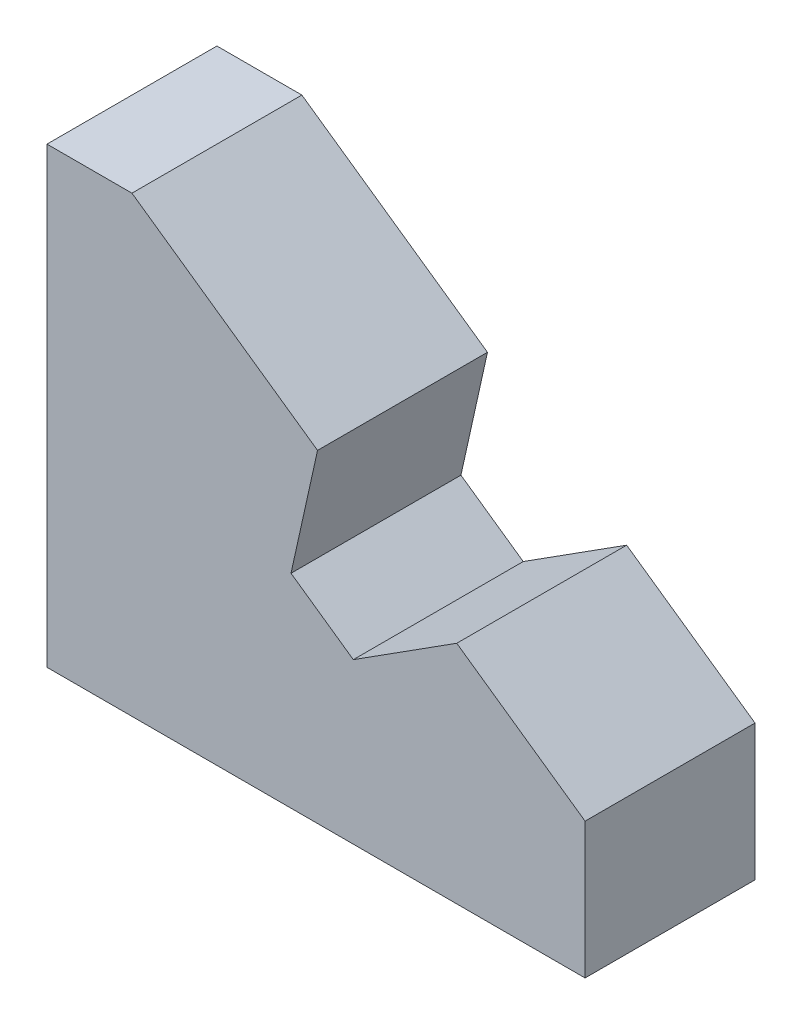
ISO-10303-21;
HEADER;
FILE_DESCRIPTION(('STEP AP214'),'2;1');
FILE_NAME('part.step','',(''),(''),'','','');
FILE_SCHEMA(('AUTOMOTIVE_DESIGN { 1 0 10303 214 1 1 1 1 }'));
ENDSEC;
DATA;
#1=APPLICATION_CONTEXT('core data for automotive mechanical design processes');
#2=APPLICATION_PROTOCOL_DEFINITION('international standard','automotive_design',2000,#1);
#3=PRODUCT_CONTEXT('',#1,'mechanical');
#4=PRODUCT('Part','Part','',(#3));
#5=PRODUCT_RELATED_PRODUCT_CATEGORY('part','',(#4));
#6=PRODUCT_DEFINITION_FORMATION('','',#4);
#7=PRODUCT_DEFINITION_CONTEXT('part definition',#1,'design');
#8=PRODUCT_DEFINITION('design','',#6,#7);
#9=PRODUCT_DEFINITION_SHAPE('','',#8);
#10=(LENGTH_UNIT() NAMED_UNIT(*) SI_UNIT(.MILLI.,.METRE.));
#11=(NAMED_UNIT(*) PLANE_ANGLE_UNIT() SI_UNIT($,.RADIAN.));
#12=(NAMED_UNIT(*) SI_UNIT($,.STERADIAN.) SOLID_ANGLE_UNIT());
#13=UNCERTAINTY_MEASURE_WITH_UNIT(LENGTH_MEASURE(1.E-05),#10,'distance_accuracy_value','');
#14=(GEOMETRIC_REPRESENTATION_CONTEXT(3) GLOBAL_UNCERTAINTY_ASSIGNED_CONTEXT((#13)) GLOBAL_UNIT_ASSIGNED_CONTEXT((#10,
#11,#12)) REPRESENTATION_CONTEXT('',''));
#15=CARTESIAN_POINT('',(0.,0.,0.));
#16=DIRECTION('',(0.,0.,1.));
#17=DIRECTION('',(1.,0.,0.));
#18=AXIS2_PLACEMENT_3D('',#15,#16,#17);
#19=CARTESIAN_POINT('',(54.0830366454055,28.2182713495315,30.));
#20=DIRECTION('',(-0.537299608346825,0.843391445812885,0.));
#21=DIRECTION('',(-0.843391445812885,-0.537299608346825,0.));
#22=AXIS2_PLACEMENT_3D('',#19,#20,#21);
#23=PLANE('',#22);
#24=DIRECTION('',(0.843391445812885,0.537299608346825,0.));
#25=VECTOR('',#24,1.);
#26=CARTESIAN_POINT('',(54.0830366454055,28.2182713495315,0.));
#27=LINE('',#26,#25);
#28=CARTESIAN_POINT('',(54.0830366454055,28.2182713495315,0.));
#29=VERTEX_POINT('',#28);
#30=CARTESIAN_POINT('',(72.3406431002294,39.8496494554267,0.));
#31=VERTEX_POINT('',#30);
#32=EDGE_CURVE('E144',#29,#31,#27,.T.);
#33=ORIENTED_EDGE('',*,*,#32,.F.);
#34=DIRECTION('',(0.,0.,-1.));
#35=VECTOR('',#34,1.);
#36=CARTESIAN_POINT('',(54.0830366454055,28.2182713495315,30.));
#37=LINE('',#36,#35);
#38=CARTESIAN_POINT('',(54.0830366454055,28.2182713495315,30.));
#39=VERTEX_POINT('',#38);
#40=EDGE_CURVE('E11',#39,#29,#37,.T.);
#41=ORIENTED_EDGE('',*,*,#40,.F.);
#42=DIRECTION('',(0.843391445812885,0.537299608346825,0.));
#43=VECTOR('',#42,1.);
#44=CARTESIAN_POINT('',(54.0830366454055,28.2182713495315,30.));
#45=LINE('',#44,#43);
#46=CARTESIAN_POINT('',(72.3406431002294,39.8496494554267,30.));
#47=VERTEX_POINT('',#46);
#48=EDGE_CURVE('E167',#39,#47,#45,.T.);
#49=ORIENTED_EDGE('',*,*,#48,.T.);
#50=DIRECTION('',(0.,0.,-1.));
#51=VECTOR('',#50,1.);
#52=CARTESIAN_POINT('',(72.3406431002294,39.8496494554267,30.));
#53=LINE('',#52,#51);
#54=EDGE_CURVE('E44',#47,#31,#53,.T.);
#55=ORIENTED_EDGE('',*,*,#54,.T.);
#56=EDGE_LOOP('',(#33,#41,#49,#55));
#57=FACE_BOUND('',#56,.T.);
#58=ADVANCED_FACE('F41',(#57),#23,.T.);
#59=CARTESIAN_POINT('',(43.0806307723416,35.9222388802937,30.));
#60=DIRECTION('',(0.573576436351047,0.819152044288991,0.));
#61=DIRECTION('',(-0.819152044288991,0.573576436351047,0.));
#62=AXIS2_PLACEMENT_3D('',#59,#60,#61);
#63=PLANE('',#62);
#64=DIRECTION('',(0.819152044288991,-0.573576436351047,0.));
#65=VECTOR('',#64,1.);
#66=CARTESIAN_POINT('',(43.0806307723416,35.9222388802937,0.));
#67=LINE('',#66,#65);
#68=CARTESIAN_POINT('',(43.0806307723416,35.9222388802937,0.));
#69=VERTEX_POINT('',#68);
#70=EDGE_CURVE('E165',#69,#29,#67,.T.);
#71=ORIENTED_EDGE('',*,*,#70,.F.);
#72=DIRECTION('',(0.,0.,-1.));
#73=VECTOR('',#72,1.);
#74=CARTESIAN_POINT('',(43.0806307723416,35.9222388802937,30.));
#75=LINE('',#74,#73);
#76=CARTESIAN_POINT('',(43.0806307723416,35.9222388802937,30.));
#77=VERTEX_POINT('',#76);
#78=EDGE_CURVE('E50',#77,#69,#75,.T.);
#79=ORIENTED_EDGE('',*,*,#78,.F.);
#80=DIRECTION('',(0.819152044288991,-0.573576436351047,0.));
#81=VECTOR('',#80,1.);
#82=CARTESIAN_POINT('',(43.0806307723416,35.9222388802937,30.));
#83=LINE('',#82,#81);
#84=EDGE_CURVE('E134',#77,#39,#83,.T.);
#85=ORIENTED_EDGE('',*,*,#84,.T.);
#86=ORIENTED_EDGE('',*,*,#40,.T.);
#87=EDGE_LOOP('',(#71,#79,#85,#86));
#88=FACE_BOUND('',#87,.T.);
#89=ADVANCED_FACE('F181',(#88),#63,.T.);
#90=CARTESIAN_POINT('',(47.7660817715596,57.0569425459581,30.));
#91=DIRECTION('',(0.976296007119932,-0.216439613938107,0.));
#92=DIRECTION('',(0.216439613938107,0.976296007119932,0.));
#93=AXIS2_PLACEMENT_3D('',#90,#91,#92);
#94=PLANE('',#93);
#95=DIRECTION('',(-0.216439613938107,-0.976296007119932,0.));
#96=VECTOR('',#95,1.);
#97=CARTESIAN_POINT('',(47.7660817715596,57.0569425459581,0.));
#98=LINE('',#97,#96);
#99=CARTESIAN_POINT('',(47.7660817715596,57.0569425459581,0.));
#100=VERTEX_POINT('',#99);
#101=EDGE_CURVE('E121',#100,#69,#98,.T.);
#102=ORIENTED_EDGE('',*,*,#101,.F.);
#103=DIRECTION('',(0.,0.,-1.));
#104=VECTOR('',#103,1.);
#105=CARTESIAN_POINT('',(47.7660817715596,57.0569425459581,30.));
#106=LINE('',#105,#104);
#107=CARTESIAN_POINT('',(47.7660817715596,57.0569425459581,30.));
#108=VERTEX_POINT('',#107);
#109=EDGE_CURVE('E116',#108,#100,#106,.T.);
#110=ORIENTED_EDGE('',*,*,#109,.F.);
#111=DIRECTION('',(-0.216439613938107,-0.976296007119932,0.));
#112=VECTOR('',#111,1.);
#113=CARTESIAN_POINT('',(47.7660817715596,57.0569425459581,30.));
#114=LINE('',#113,#112);
#115=EDGE_CURVE('E119',#108,#77,#114,.T.);
#116=ORIENTED_EDGE('',*,*,#115,.T.);
#117=ORIENTED_EDGE('',*,*,#78,.T.);
#118=EDGE_LOOP('',(#102,#110,#116,#117));
#119=FACE_BOUND('',#118,.T.);
#120=ADVANCED_FACE('F118',(#119),#94,.T.);
#121=CARTESIAN_POINT('',(15.,80.,30.));
#122=DIRECTION('',(0.573576436351047,0.819152044288991,0.));
#123=DIRECTION('',(-0.819152044288991,0.573576436351047,0.));
#124=AXIS2_PLACEMENT_3D('',#121,#122,#123);
#125=PLANE('',#124);
#126=DIRECTION('',(0.819152044288991,-0.573576436351047,0.));
#127=VECTOR('',#126,1.);
#128=CARTESIAN_POINT('',(15.,80.,0.));
#129=LINE('',#128,#127);
#130=CARTESIAN_POINT('',(15.,80.,0.));
#131=VERTEX_POINT('',#130);
#132=EDGE_CURVE('E162',#131,#100,#129,.T.);
#133=ORIENTED_EDGE('',*,*,#132,.F.);
#134=DIRECTION('',(0.,0.,-1.));
#135=VECTOR('',#134,1.);
#136=CARTESIAN_POINT('',(15.,80.,30.));
#137=LINE('',#136,#135);
#138=CARTESIAN_POINT('',(15.,80.,30.));
#139=VERTEX_POINT('',#138);
#140=EDGE_CURVE('E126',#139,#131,#137,.T.);
#141=ORIENTED_EDGE('',*,*,#140,.F.);
#142=DIRECTION('',(0.819152044288991,-0.573576436351047,0.));
#143=VECTOR('',#142,1.);
#144=CARTESIAN_POINT('',(15.,80.,30.));
#145=LINE('',#144,#143);
#146=EDGE_CURVE('E132',#139,#108,#145,.T.);
#147=ORIENTED_EDGE('',*,*,#146,.T.);
#148=ORIENTED_EDGE('',*,*,#109,.T.);
#149=EDGE_LOOP('',(#133,#141,#147,#148));
#150=FACE_BOUND('',#149,.T.);
#151=ADVANCED_FACE('F136',(#150),#125,.T.);
#152=CARTESIAN_POINT('',(0.,80.,30.));
#153=DIRECTION('',(0.,1.,0.));
#154=DIRECTION('',(0.,0.,1.));
#155=AXIS2_PLACEMENT_3D('',#152,#153,#154);
#156=PLANE('',#155);
#157=DIRECTION('',(1.,0.,0.));
#158=VECTOR('',#157,1.);
#159=CARTESIAN_POINT('',(0.,80.,0.));
#160=LINE('',#159,#158);
#161=CARTESIAN_POINT('',(0.,80.,0.));
#162=VERTEX_POINT('',#161);
#163=EDGE_CURVE('E159',#162,#131,#160,.T.);
#164=ORIENTED_EDGE('',*,*,#163,.F.);
#165=DIRECTION('',(0.,0.,-1.));
#166=VECTOR('',#165,1.);
#167=CARTESIAN_POINT('',(0.,80.,30.));
#168=LINE('',#167,#166);
#169=CARTESIAN_POINT('',(0.,80.,30.));
#170=VERTEX_POINT('',#169);
#171=EDGE_CURVE('E171',#170,#162,#168,.T.);
#172=ORIENTED_EDGE('',*,*,#171,.F.);
#173=DIRECTION('',(1.,0.,0.));
#174=VECTOR('',#173,1.);
#175=CARTESIAN_POINT('',(0.,80.,30.));
#176=LINE('',#175,#174);
#177=EDGE_CURVE('E137',#170,#139,#176,.T.);
#178=ORIENTED_EDGE('',*,*,#177,.T.);
#179=ORIENTED_EDGE('',*,*,#140,.T.);
#180=EDGE_LOOP('',(#164,#172,#178,#179));
#181=FACE_BOUND('',#180,.T.);
#182=ADVANCED_FACE('F194',(#181),#156,.T.);
#183=CARTESIAN_POINT('',(0.,0.,30.));
#184=DIRECTION('',(-1.,0.,0.));
#185=DIRECTION('',(0.,0.,1.));
#186=AXIS2_PLACEMENT_3D('',#183,#184,#185);
#187=PLANE('',#186);
#188=DIRECTION('',(0.,1.,0.));
#189=VECTOR('',#188,1.);
#190=CARTESIAN_POINT('',(0.,0.,0.));
#191=LINE('',#190,#189);
#192=CARTESIAN_POINT('',(0.,0.,0.));
#193=VERTEX_POINT('',#192);
#194=EDGE_CURVE('E156',#193,#162,#191,.T.);
#195=ORIENTED_EDGE('',*,*,#194,.F.);
#196=DIRECTION('',(0.,0.,-1.));
#197=VECTOR('',#196,1.);
#198=CARTESIAN_POINT('',(0.,0.,30.));
#199=LINE('',#198,#197);
#200=CARTESIAN_POINT('',(0.,0.,30.));
#201=VERTEX_POINT('',#200);
#202=EDGE_CURVE('E173',#201,#193,#199,.T.);
#203=ORIENTED_EDGE('',*,*,#202,.F.);
#204=DIRECTION('',(0.,1.,0.));
#205=VECTOR('',#204,1.);
#206=CARTESIAN_POINT('',(0.,0.,30.));
#207=LINE('',#206,#205);
#208=EDGE_CURVE('E139',#201,#170,#207,.T.);
#209=ORIENTED_EDGE('',*,*,#208,.T.);
#210=ORIENTED_EDGE('',*,*,#171,.T.);
#211=EDGE_LOOP('',(#195,#203,#209,#210));
#212=FACE_BOUND('',#211,.T.);
#213=ADVANCED_FACE('F197',(#212),#187,.T.);
#214=CARTESIAN_POINT('',(95.,0.,30.));
#215=DIRECTION('',(0.,-1.,0.));
#216=DIRECTION('',(0.,0.,-1.));
#217=AXIS2_PLACEMENT_3D('',#214,#215,#216);
#218=PLANE('',#217);
#219=DIRECTION('',(-1.,0.,0.));
#220=VECTOR('',#219,1.);
#221=CARTESIAN_POINT('',(95.,0.,0.));
#222=LINE('',#221,#220);
#223=CARTESIAN_POINT('',(95.,0.,0.));
#224=VERTEX_POINT('',#223);
#225=EDGE_CURVE('E153',#224,#193,#222,.T.);
#226=ORIENTED_EDGE('',*,*,#225,.F.);
#227=DIRECTION('',(0.,0.,-1.));
#228=VECTOR('',#227,1.);
#229=CARTESIAN_POINT('',(95.,0.,30.));
#230=LINE('',#229,#228);
#231=CARTESIAN_POINT('',(95.,0.,30.));
#232=VERTEX_POINT('',#231);
#233=EDGE_CURVE('E175',#232,#224,#230,.T.);
#234=ORIENTED_EDGE('',*,*,#233,.F.);
#235=DIRECTION('',(-1.,0.,0.));
#236=VECTOR('',#235,1.);
#237=CARTESIAN_POINT('',(95.,0.,30.));
#238=LINE('',#237,#236);
#239=EDGE_CURVE('E304',#232,#201,#238,.T.);
#240=ORIENTED_EDGE('',*,*,#239,.T.);
#241=ORIENTED_EDGE('',*,*,#202,.T.);
#242=EDGE_LOOP('',(#226,#234,#240,#241));
#243=FACE_BOUND('',#242,.T.);
#244=ADVANCED_FACE('F201',(#243),#218,.T.);
#245=CARTESIAN_POINT('',(95.,23.983396943223,30.));
#246=DIRECTION('',(1.,0.,0.));
#247=DIRECTION('',(0.,0.,-1.));
#248=AXIS2_PLACEMENT_3D('',#245,#246,#247);
#249=PLANE('',#248);
#250=DIRECTION('',(0.,-1.,0.));
#251=VECTOR('',#250,1.);
#252=CARTESIAN_POINT('',(95.,23.983396943223,0.));
#253=LINE('',#252,#251);
#254=CARTESIAN_POINT('',(95.,23.983396943223,0.));
#255=VERTEX_POINT('',#254);
#256=EDGE_CURVE('E150',#255,#224,#253,.T.);
#257=ORIENTED_EDGE('',*,*,#256,.F.);
#258=DIRECTION('',(0.,0.,-1.));
#259=VECTOR('',#258,1.);
#260=CARTESIAN_POINT('',(95.,23.983396943223,30.));
#261=LINE('',#260,#259);
#262=CARTESIAN_POINT('',(95.,23.983396943223,30.));
#263=VERTEX_POINT('',#262);
#264=EDGE_CURVE('E176',#263,#255,#261,.T.);
#265=ORIENTED_EDGE('',*,*,#264,.F.);
#266=DIRECTION('',(0.,-1.,0.));
#267=VECTOR('',#266,1.);
#268=CARTESIAN_POINT('',(95.,23.983396943223,30.));
#269=LINE('',#268,#267);
#270=EDGE_CURVE('E308',#263,#232,#269,.T.);
#271=ORIENTED_EDGE('',*,*,#270,.T.);
#272=ORIENTED_EDGE('',*,*,#233,.T.);
#273=EDGE_LOOP('',(#257,#265,#271,#272));
#274=FACE_BOUND('',#273,.T.);
#275=ADVANCED_FACE('F205',(#274),#249,.T.);
#276=CARTESIAN_POINT('',(72.3406431002294,39.8496494554267,30.));
#277=DIRECTION('',(0.573576436351047,0.819152044288991,0.));
#278=DIRECTION('',(-0.819152044288991,0.573576436351047,0.));
#279=AXIS2_PLACEMENT_3D('',#276,#277,#278);
#280=PLANE('',#279);
#281=DIRECTION('',(0.819152044288991,-0.573576436351047,0.));
#282=VECTOR('',#281,1.);
#283=CARTESIAN_POINT('',(72.3406431002294,39.8496494554267,0.));
#284=LINE('',#283,#282);
#285=EDGE_CURVE('E147',#31,#255,#284,.T.);
#286=ORIENTED_EDGE('',*,*,#285,.F.);
#287=ORIENTED_EDGE('',*,*,#54,.F.);
#288=DIRECTION('',(0.819152044288991,-0.573576436351047,0.));
#289=VECTOR('',#288,1.);
#290=CARTESIAN_POINT('',(72.3406431002294,39.8496494554267,30.));
#291=LINE('',#290,#289);
#292=EDGE_CURVE('E312',#47,#263,#291,.T.);
#293=ORIENTED_EDGE('',*,*,#292,.T.);
#294=ORIENTED_EDGE('',*,*,#264,.T.);
#295=EDGE_LOOP('',(#286,#287,#293,#294));
#296=FACE_BOUND('',#295,.T.);
#297=ADVANCED_FACE('F178',(#296),#280,.T.);
#298=CARTESIAN_POINT('',(0.,0.,30.));
#299=DIRECTION('',(0.,0.,-1.));
#300=DIRECTION('',(-1.,0.,0.));
#301=AXIS2_PLACEMENT_3D('',#298,#299,#300);
#302=PLANE('',#301);
#303=ORIENTED_EDGE('',*,*,#48,.F.);
#304=ORIENTED_EDGE('',*,*,#84,.F.);
#305=ORIENTED_EDGE('',*,*,#115,.F.);
#306=ORIENTED_EDGE('',*,*,#146,.F.);
#307=ORIENTED_EDGE('',*,*,#177,.F.);
#308=ORIENTED_EDGE('',*,*,#208,.F.);
#309=ORIENTED_EDGE('',*,*,#239,.F.);
#310=ORIENTED_EDGE('',*,*,#270,.F.);
#311=ORIENTED_EDGE('',*,*,#292,.F.);
#312=EDGE_LOOP('',(#303,#304,#305,#306,#307,#308,#309,#310,#311));
#313=FACE_BOUND('',#312,.T.);
#314=ADVANCED_FACE('F130',(#313),#302,.F.);
#315=CARTESIAN_POINT('',(0.,0.,0.));
#316=DIRECTION('',(0.,0.,-1.));
#317=DIRECTION('',(-1.,0.,0.));
#318=AXIS2_PLACEMENT_3D('',#315,#316,#317);
#319=PLANE('',#318);
#320=ORIENTED_EDGE('',*,*,#32,.T.);
#321=ORIENTED_EDGE('',*,*,#285,.T.);
#322=ORIENTED_EDGE('',*,*,#256,.T.);
#323=ORIENTED_EDGE('',*,*,#225,.T.);
#324=ORIENTED_EDGE('',*,*,#194,.T.);
#325=ORIENTED_EDGE('',*,*,#163,.T.);
#326=ORIENTED_EDGE('',*,*,#132,.T.);
#327=ORIENTED_EDGE('',*,*,#101,.T.);
#328=ORIENTED_EDGE('',*,*,#70,.T.);
#329=EDGE_LOOP('',(#320,#321,#322,#323,#324,#325,#326,#327,#328));
#330=FACE_BOUND('',#329,.T.);
#331=ADVANCED_FACE('F180',(#330),#319,.T.);
#332=CLOSED_SHELL('',(#58,#89,#120,#151,#182,#213,#244,#275,#297,#314,#331));
#333=MANIFOLD_SOLID_BREP('B2',#332);
#334=ADVANCED_BREP_SHAPE_REPRESENTATION('',(#18,#333),#14);
#335=SHAPE_DEFINITION_REPRESENTATION(#9,#334);
ENDSEC;
END-ISO-10303-21;
